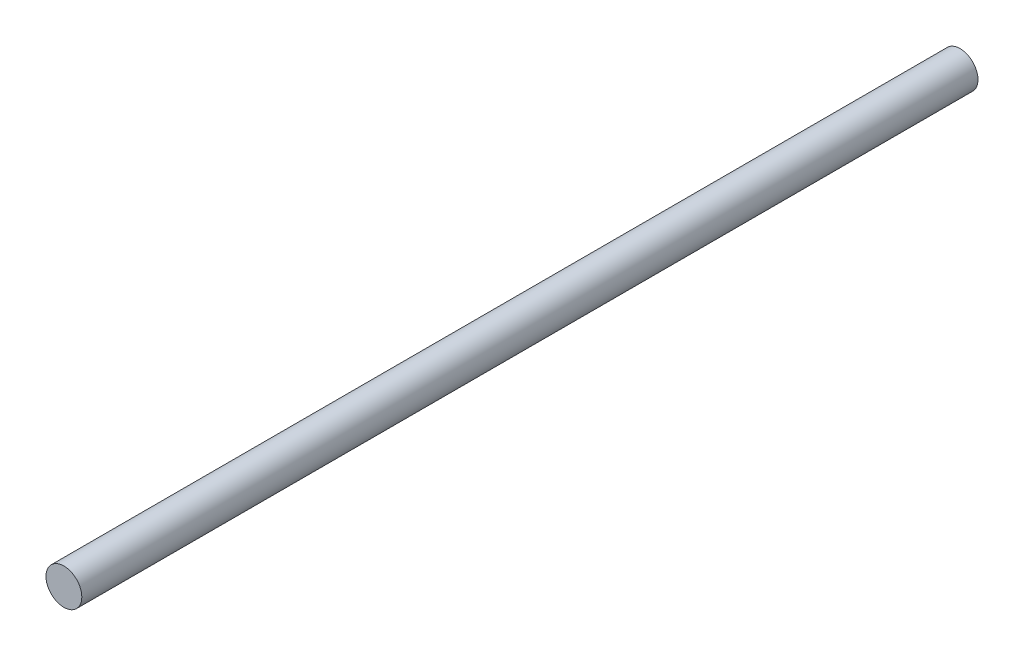
ISO-10303-21;
HEADER;
FILE_DESCRIPTION(('STEP AP214'),'2;1');
FILE_NAME('part.step','',(''),(''),'','','');
FILE_SCHEMA(('AUTOMOTIVE_DESIGN { 1 0 10303 214 1 1 1 1 }'));
ENDSEC;
DATA;
#1=APPLICATION_CONTEXT('core data for automotive mechanical design processes');
#2=APPLICATION_PROTOCOL_DEFINITION('international standard','automotive_design',2000,#1);
#3=PRODUCT_CONTEXT('',#1,'mechanical');
#4=PRODUCT('Part','Part','',(#3));
#5=PRODUCT_RELATED_PRODUCT_CATEGORY('part','',(#4));
#6=PRODUCT_DEFINITION_FORMATION('','',#4);
#7=PRODUCT_DEFINITION_CONTEXT('part definition',#1,'design');
#8=PRODUCT_DEFINITION('design','',#6,#7);
#9=PRODUCT_DEFINITION_SHAPE('','',#8);
#10=(LENGTH_UNIT() NAMED_UNIT(*) SI_UNIT(.MILLI.,.METRE.));
#11=(NAMED_UNIT(*) PLANE_ANGLE_UNIT() SI_UNIT($,.RADIAN.));
#12=(NAMED_UNIT(*) SI_UNIT($,.STERADIAN.) SOLID_ANGLE_UNIT());
#13=UNCERTAINTY_MEASURE_WITH_UNIT(LENGTH_MEASURE(1.E-05),#10,'distance_accuracy_value','');
#14=(GEOMETRIC_REPRESENTATION_CONTEXT(3) GLOBAL_UNCERTAINTY_ASSIGNED_CONTEXT((#13)) GLOBAL_UNIT_ASSIGNED_CONTEXT((#10,
#11,#12)) REPRESENTATION_CONTEXT('',''));
#15=CARTESIAN_POINT('',(0.,0.,0.));
#16=DIRECTION('',(0.,0.,1.));
#17=DIRECTION('',(1.,0.,0.));
#18=AXIS2_PLACEMENT_3D('',#15,#16,#17);
#19=CARTESIAN_POINT('',(0.,0.,75.));
#20=DIRECTION('',(0.,0.,-1.));
#21=DIRECTION('',(-1.,0.,0.));
#22=AXIS2_PLACEMENT_3D('',#19,#20,#21);
#23=CYLINDRICAL_SURFACE('',#22,1.5);
#24=CARTESIAN_POINT('',(0.,0.,75.));
#25=DIRECTION('',(0.,0.,1.));
#26=DIRECTION('',(1.,0.,0.));
#27=AXIS2_PLACEMENT_3D('',#24,#25,#26);
#28=CIRCLE('',#27,1.5);
#29=CARTESIAN_POINT('',(1.5,0.,75.));
#30=VERTEX_POINT('',#29);
#31=EDGE_CURVE('E10',#30,#30,#28,.T.);
#32=ORIENTED_EDGE('',*,*,#31,.F.);
#33=EDGE_LOOP('',(#32));
#34=FACE_BOUND('',#33,.T.);
#35=CARTESIAN_POINT('',(0.,0.,0.));
#36=DIRECTION('',(0.,0.,1.));
#37=DIRECTION('',(1.,0.,0.));
#38=AXIS2_PLACEMENT_3D('',#35,#36,#37);
#39=CIRCLE('',#38,1.5);
#40=CARTESIAN_POINT('',(1.5,0.,0.));
#41=VERTEX_POINT('',#40);
#42=EDGE_CURVE('E42',#41,#41,#39,.T.);
#43=ORIENTED_EDGE('',*,*,#42,.T.);
#44=EDGE_LOOP('',(#43));
#45=FACE_BOUND('',#44,.T.);
#46=ADVANCED_FACE('F39',(#34,#45),#23,.T.);
#47=CARTESIAN_POINT('',(0.,0.,75.));
#48=DIRECTION('',(0.,0.,1.));
#49=DIRECTION('',(1.,0.,0.));
#50=AXIS2_PLACEMENT_3D('',#47,#48,#49);
#51=PLANE('',#50);
#52=ORIENTED_EDGE('',*,*,#31,.T.);
#53=EDGE_LOOP('',(#52));
#54=FACE_BOUND('',#53,.T.);
#55=ADVANCED_FACE('F54',(#54),#51,.T.);
#56=CARTESIAN_POINT('',(0.,0.,0.));
#57=DIRECTION('',(0.,0.,1.));
#58=DIRECTION('',(1.,0.,0.));
#59=AXIS2_PLACEMENT_3D('',#56,#57,#58);
#60=PLANE('',#59);
#61=ORIENTED_EDGE('',*,*,#42,.F.);
#62=EDGE_LOOP('',(#61));
#63=FACE_BOUND('',#62,.T.);
#64=ADVANCED_FACE('F52',(#63),#60,.F.);
#65=CLOSED_SHELL('',(#46,#55,#64));
#66=MANIFOLD_SOLID_BREP('B2',#65);
#67=ADVANCED_BREP_SHAPE_REPRESENTATION('',(#18,#66),#14);
#68=SHAPE_DEFINITION_REPRESENTATION(#9,#67);
ENDSEC;
END-ISO-10303-21;
